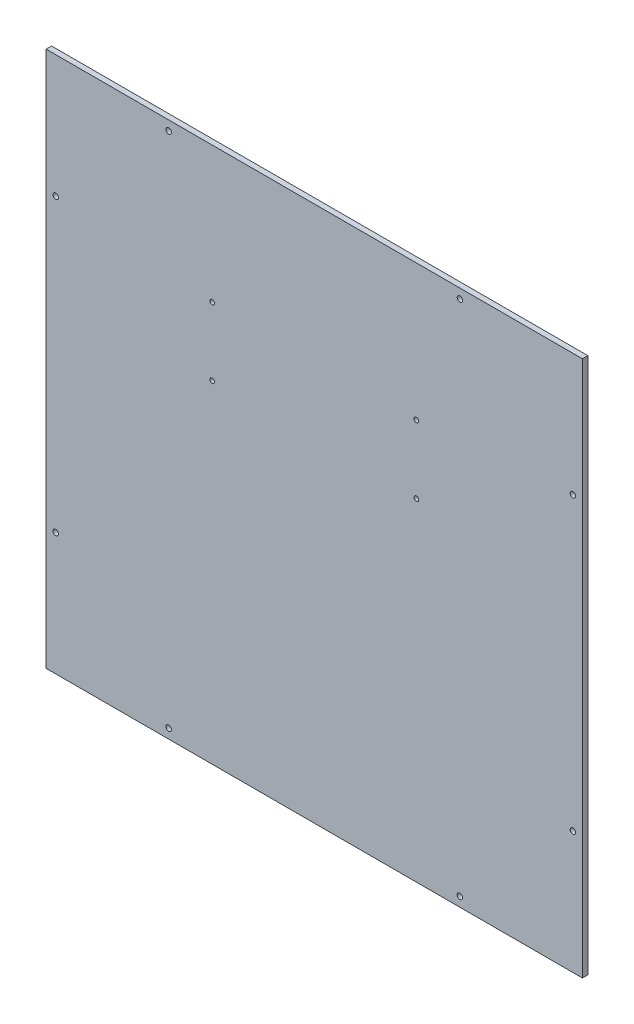
ISO-10303-21;
HEADER;
FILE_DESCRIPTION(('STEP AP214'),'2;1');
FILE_NAME('part.step','',(''),(''),'','','');
FILE_SCHEMA(('AUTOMOTIVE_DESIGN { 1 0 10303 214 1 1 1 1 }'));
ENDSEC;
DATA;
#1=APPLICATION_CONTEXT('core data for automotive mechanical design processes');
#2=APPLICATION_PROTOCOL_DEFINITION('international standard','automotive_design',2000,#1);
#3=PRODUCT_CONTEXT('',#1,'mechanical');
#4=PRODUCT('Part','Part','',(#3));
#5=PRODUCT_RELATED_PRODUCT_CATEGORY('part','',(#4));
#6=PRODUCT_DEFINITION_FORMATION('','',#4);
#7=PRODUCT_DEFINITION_CONTEXT('part definition',#1,'design');
#8=PRODUCT_DEFINITION('design','',#6,#7);
#9=PRODUCT_DEFINITION_SHAPE('','',#8);
#10=(LENGTH_UNIT() NAMED_UNIT(*) SI_UNIT(.MILLI.,.METRE.));
#11=(NAMED_UNIT(*) PLANE_ANGLE_UNIT() SI_UNIT($,.RADIAN.));
#12=(NAMED_UNIT(*) SI_UNIT($,.STERADIAN.) SOLID_ANGLE_UNIT());
#13=UNCERTAINTY_MEASURE_WITH_UNIT(LENGTH_MEASURE(1.E-05),#10,'distance_accuracy_value','');
#14=(GEOMETRIC_REPRESENTATION_CONTEXT(3) GLOBAL_UNCERTAINTY_ASSIGNED_CONTEXT((#13)) GLOBAL_UNIT_ASSIGNED_CONTEXT((#10,
#11,#12)) REPRESENTATION_CONTEXT('',''));
#15=CARTESIAN_POINT('',(0.,0.,0.));
#16=DIRECTION('',(0.,0.,1.));
#17=DIRECTION('',(1.,0.,0.));
#18=AXIS2_PLACEMENT_3D('',#15,#16,#17);
#19=CARTESIAN_POINT('',(0.,0.,4.));
#20=DIRECTION('',(0.,0.,-1.));
#21=DIRECTION('',(-1.,0.,0.));
#22=AXIS2_PLACEMENT_3D('',#19,#20,#21);
#23=PLANE('',#22);
#24=CARTESIAN_POINT('',(272.,244.,4.));
#25=DIRECTION('',(0.,0.,1.));
#26=DIRECTION('',(1.,0.,0.));
#27=AXIS2_PLACEMENT_3D('',#24,#25,#26);
#28=CIRCLE('',#27,1.69999999999996);
#29=CARTESIAN_POINT('',(273.7,244.,4.));
#30=VERTEX_POINT('',#29);
#31=EDGE_CURVE('E180',#30,#30,#28,.T.);
#32=ORIENTED_EDGE('',*,*,#31,.F.);
#33=EDGE_LOOP('',(#32));
#34=FACE_BOUND('',#33,.T.);
#35=CARTESIAN_POINT('',(272.,294.,4.));
#36=DIRECTION('',(0.,0.,1.));
#37=DIRECTION('',(1.,0.,0.));
#38=AXIS2_PLACEMENT_3D('',#35,#36,#37);
#39=CIRCLE('',#38,1.69999999999995);
#40=CARTESIAN_POINT('',(273.7,294.,4.));
#41=VERTEX_POINT('',#40);
#42=EDGE_CURVE('E174',#41,#41,#39,.T.);
#43=ORIENTED_EDGE('',*,*,#42,.F.);
#44=EDGE_LOOP('',(#43));
#45=FACE_BOUND('',#44,.T.);
#46=CARTESIAN_POINT('',(122.,244.,4.));
#47=DIRECTION('',(0.,0.,1.));
#48=DIRECTION('',(1.,0.,0.));
#49=AXIS2_PLACEMENT_3D('',#46,#47,#48);
#50=CIRCLE('',#49,1.70000000000001);
#51=CARTESIAN_POINT('',(123.7,244.,4.));
#52=VERTEX_POINT('',#51);
#53=EDGE_CURVE('E168',#52,#52,#50,.T.);
#54=ORIENTED_EDGE('',*,*,#53,.F.);
#55=EDGE_LOOP('',(#54));
#56=FACE_BOUND('',#55,.T.);
#57=CARTESIAN_POINT('',(122.,294.,4.));
#58=DIRECTION('',(0.,0.,1.));
#59=DIRECTION('',(1.,0.,0.));
#60=AXIS2_PLACEMENT_3D('',#57,#58,#59);
#61=CIRCLE('',#60,1.70000000000001);
#62=CARTESIAN_POINT('',(123.7,294.,4.));
#63=VERTEX_POINT('',#62);
#64=EDGE_CURVE('E162',#63,#63,#61,.T.);
#65=ORIENTED_EDGE('',*,*,#64,.F.);
#66=EDGE_LOOP('',(#65));
#67=FACE_BOUND('',#66,.T.);
#68=CARTESIAN_POINT('',(90.,7.00000000000001,4.));
#69=DIRECTION('',(0.,0.,1.));
#70=DIRECTION('',(-1.,0.,0.));
#71=AXIS2_PLACEMENT_3D('',#68,#69,#70);
#72=CIRCLE('',#71,2.);
#73=CARTESIAN_POINT('',(88.,7.00000000000001,4.));
#74=VERTEX_POINT('',#73);
#75=EDGE_CURVE('E147',#74,#74,#72,.T.);
#76=ORIENTED_EDGE('',*,*,#75,.F.);
#77=EDGE_LOOP('',(#76));
#78=FACE_BOUND('',#77,.T.);
#79=CARTESIAN_POINT('',(387.,90.,4.));
#80=DIRECTION('',(0.,0.,1.));
#81=DIRECTION('',(-1.,0.,0.));
#82=AXIS2_PLACEMENT_3D('',#79,#80,#81);
#83=CIRCLE('',#82,2.);
#84=CARTESIAN_POINT('',(385.,90.,4.));
#85=VERTEX_POINT('',#84);
#86=EDGE_CURVE('E135',#85,#85,#83,.T.);
#87=ORIENTED_EDGE('',*,*,#86,.F.);
#88=EDGE_LOOP('',(#87));
#89=FACE_BOUND('',#88,.T.);
#90=CARTESIAN_POINT('',(387.,304.,4.));
#91=DIRECTION('',(0.,0.,1.));
#92=DIRECTION('',(1.,0.,0.));
#93=AXIS2_PLACEMENT_3D('',#90,#91,#92);
#94=CIRCLE('',#93,2.);
#95=CARTESIAN_POINT('',(389.,304.,4.));
#96=VERTEX_POINT('',#95);
#97=EDGE_CURVE('E123',#96,#96,#94,.T.);
#98=ORIENTED_EDGE('',*,*,#97,.F.);
#99=EDGE_LOOP('',(#98));
#100=FACE_BOUND('',#99,.T.);
#101=CARTESIAN_POINT('',(90.,387.,4.));
#102=DIRECTION('',(0.,0.,1.));
#103=DIRECTION('',(1.,0.,0.));
#104=AXIS2_PLACEMENT_3D('',#101,#102,#103);
#105=CIRCLE('',#104,2.);
#106=CARTESIAN_POINT('',(92.,387.,4.));
#107=VERTEX_POINT('',#106);
#108=EDGE_CURVE('E102',#107,#107,#105,.T.);
#109=ORIENTED_EDGE('',*,*,#108,.F.);
#110=EDGE_LOOP('',(#109));
#111=FACE_BOUND('',#110,.T.);
#112=DIRECTION('',(1.,0.,0.));
#113=VECTOR('',#112,1.);
#114=CARTESIAN_POINT('',(394.,0.,4.));
#115=LINE('',#114,#113);
#116=CARTESIAN_POINT('',(0.,0.,4.));
#117=VERTEX_POINT('',#116);
#118=CARTESIAN_POINT('',(394.,0.,4.));
#119=VERTEX_POINT('',#118);
#120=EDGE_CURVE('E87',#117,#119,#115,.T.);
#121=ORIENTED_EDGE('',*,*,#120,.T.);
#122=DIRECTION('',(0.,1.,0.));
#123=VECTOR('',#122,1.);
#124=CARTESIAN_POINT('',(394.,394.,4.));
#125=LINE('',#124,#123);
#126=CARTESIAN_POINT('',(394.,394.,4.));
#127=VERTEX_POINT('',#126);
#128=EDGE_CURVE('E82',#119,#127,#125,.T.);
#129=ORIENTED_EDGE('',*,*,#128,.T.);
#130=DIRECTION('',(-1.,0.,0.));
#131=VECTOR('',#130,1.);
#132=CARTESIAN_POINT('',(0.,394.,4.));
#133=LINE('',#132,#131);
#134=CARTESIAN_POINT('',(0.,394.,4.));
#135=VERTEX_POINT('',#134);
#136=EDGE_CURVE('E85',#127,#135,#133,.T.);
#137=ORIENTED_EDGE('',*,*,#136,.T.);
#138=DIRECTION('',(0.,-1.,0.));
#139=VECTOR('',#138,1.);
#140=CARTESIAN_POINT('',(0.,0.,4.));
#141=LINE('',#140,#139);
#142=EDGE_CURVE('E52',#135,#117,#141,.T.);
#143=ORIENTED_EDGE('',*,*,#142,.T.);
#144=EDGE_LOOP('',(#121,#129,#137,#143));
#145=FACE_BOUND('',#144,.T.);
#146=CARTESIAN_POINT('',(304.,387.,4.));
#147=DIRECTION('',(0.,0.,1.));
#148=DIRECTION('',(-1.,0.,0.));
#149=AXIS2_PLACEMENT_3D('',#146,#147,#148);
#150=CIRCLE('',#149,2.);
#151=CARTESIAN_POINT('',(302.,387.,4.));
#152=VERTEX_POINT('',#151);
#153=EDGE_CURVE('E117',#152,#152,#150,.T.);
#154=ORIENTED_EDGE('',*,*,#153,.F.);
#155=EDGE_LOOP('',(#154));
#156=FACE_BOUND('',#155,.T.);
#157=CARTESIAN_POINT('',(7.00000000000001,304.,4.));
#158=DIRECTION('',(0.,0.,1.));
#159=DIRECTION('',(-1.,0.,0.));
#160=AXIS2_PLACEMENT_3D('',#157,#158,#159);
#161=CIRCLE('',#160,2.);
#162=CARTESIAN_POINT('',(5.00000000000001,304.,4.));
#163=VERTEX_POINT('',#162);
#164=EDGE_CURVE('E129',#163,#163,#161,.T.);
#165=ORIENTED_EDGE('',*,*,#164,.F.);
#166=EDGE_LOOP('',(#165));
#167=FACE_BOUND('',#166,.T.);
#168=CARTESIAN_POINT('',(304.,7.00000000000001,4.));
#169=DIRECTION('',(0.,0.,1.));
#170=DIRECTION('',(1.,0.,0.));
#171=AXIS2_PLACEMENT_3D('',#168,#169,#170);
#172=CIRCLE('',#171,2.);
#173=CARTESIAN_POINT('',(306.,7.00000000000001,4.));
#174=VERTEX_POINT('',#173);
#175=EDGE_CURVE('E141',#174,#174,#172,.T.);
#176=ORIENTED_EDGE('',*,*,#175,.F.);
#177=EDGE_LOOP('',(#176));
#178=FACE_BOUND('',#177,.T.);
#179=CARTESIAN_POINT('',(7.00000000000001,90.,4.));
#180=DIRECTION('',(0.,0.,1.));
#181=DIRECTION('',(1.,0.,0.));
#182=AXIS2_PLACEMENT_3D('',#179,#180,#181);
#183=CIRCLE('',#182,1.99999999999999);
#184=CARTESIAN_POINT('',(9.,90.,4.));
#185=VERTEX_POINT('',#184);
#186=EDGE_CURVE('E153',#185,#185,#183,.T.);
#187=ORIENTED_EDGE('',*,*,#186,.F.);
#188=EDGE_LOOP('',(#187));
#189=FACE_BOUND('',#188,.T.);
#190=ADVANCED_FACE('F35',(#34,#45,#56,#67,#78,#89,#100,#111,#145,#156,#167,#178,#189),#23,.F.);
#191=CARTESIAN_POINT('',(0.,0.,0.));
#192=DIRECTION('',(0.,0.,-1.));
#193=DIRECTION('',(-1.,0.,0.));
#194=AXIS2_PLACEMENT_3D('',#191,#192,#193);
#195=PLANE('',#194);
#196=CARTESIAN_POINT('',(272.,244.,0.));
#197=DIRECTION('',(0.,0.,1.));
#198=DIRECTION('',(1.,0.,0.));
#199=AXIS2_PLACEMENT_3D('',#196,#197,#198);
#200=CIRCLE('',#199,1.69999999999996);
#201=CARTESIAN_POINT('',(273.7,244.,0.));
#202=VERTEX_POINT('',#201);
#203=EDGE_CURVE('E177',#202,#202,#200,.T.);
#204=ORIENTED_EDGE('',*,*,#203,.T.);
#205=EDGE_LOOP('',(#204));
#206=FACE_BOUND('',#205,.T.);
#207=CARTESIAN_POINT('',(272.,294.,0.));
#208=DIRECTION('',(0.,0.,1.));
#209=DIRECTION('',(1.,0.,0.));
#210=AXIS2_PLACEMENT_3D('',#207,#208,#209);
#211=CIRCLE('',#210,1.69999999999995);
#212=CARTESIAN_POINT('',(273.7,294.,0.));
#213=VERTEX_POINT('',#212);
#214=EDGE_CURVE('E171',#213,#213,#211,.T.);
#215=ORIENTED_EDGE('',*,*,#214,.T.);
#216=EDGE_LOOP('',(#215));
#217=FACE_BOUND('',#216,.T.);
#218=CARTESIAN_POINT('',(122.,244.,0.));
#219=DIRECTION('',(0.,0.,1.));
#220=DIRECTION('',(1.,0.,0.));
#221=AXIS2_PLACEMENT_3D('',#218,#219,#220);
#222=CIRCLE('',#221,1.70000000000001);
#223=CARTESIAN_POINT('',(123.7,244.,0.));
#224=VERTEX_POINT('',#223);
#225=EDGE_CURVE('E165',#224,#224,#222,.T.);
#226=ORIENTED_EDGE('',*,*,#225,.T.);
#227=EDGE_LOOP('',(#226));
#228=FACE_BOUND('',#227,.T.);
#229=CARTESIAN_POINT('',(122.,294.,0.));
#230=DIRECTION('',(0.,0.,1.));
#231=DIRECTION('',(1.,0.,0.));
#232=AXIS2_PLACEMENT_3D('',#229,#230,#231);
#233=CIRCLE('',#232,1.70000000000001);
#234=CARTESIAN_POINT('',(123.7,294.,0.));
#235=VERTEX_POINT('',#234);
#236=EDGE_CURVE('E159',#235,#235,#233,.T.);
#237=ORIENTED_EDGE('',*,*,#236,.T.);
#238=EDGE_LOOP('',(#237));
#239=FACE_BOUND('',#238,.T.);
#240=CARTESIAN_POINT('',(90.,7.00000000000001,0.));
#241=DIRECTION('',(0.,0.,1.));
#242=DIRECTION('',(-1.,0.,0.));
#243=AXIS2_PLACEMENT_3D('',#240,#241,#242);
#244=CIRCLE('',#243,2.);
#245=CARTESIAN_POINT('',(88.,7.00000000000001,0.));
#246=VERTEX_POINT('',#245);
#247=EDGE_CURVE('E150',#246,#246,#244,.T.);
#248=ORIENTED_EDGE('',*,*,#247,.T.);
#249=EDGE_LOOP('',(#248));
#250=FACE_BOUND('',#249,.T.);
#251=CARTESIAN_POINT('',(387.,90.,0.));
#252=DIRECTION('',(0.,0.,1.));
#253=DIRECTION('',(-1.,0.,0.));
#254=AXIS2_PLACEMENT_3D('',#251,#252,#253);
#255=CIRCLE('',#254,2.);
#256=CARTESIAN_POINT('',(385.,90.,0.));
#257=VERTEX_POINT('',#256);
#258=EDGE_CURVE('E138',#257,#257,#255,.T.);
#259=ORIENTED_EDGE('',*,*,#258,.T.);
#260=EDGE_LOOP('',(#259));
#261=FACE_BOUND('',#260,.T.);
#262=CARTESIAN_POINT('',(387.,304.,0.));
#263=DIRECTION('',(0.,0.,1.));
#264=DIRECTION('',(1.,0.,0.));
#265=AXIS2_PLACEMENT_3D('',#262,#263,#264);
#266=CIRCLE('',#265,2.);
#267=CARTESIAN_POINT('',(389.,304.,0.));
#268=VERTEX_POINT('',#267);
#269=EDGE_CURVE('E126',#268,#268,#266,.T.);
#270=ORIENTED_EDGE('',*,*,#269,.T.);
#271=EDGE_LOOP('',(#270));
#272=FACE_BOUND('',#271,.T.);
#273=CARTESIAN_POINT('',(90.,387.,0.));
#274=DIRECTION('',(0.,0.,1.));
#275=DIRECTION('',(1.,0.,0.));
#276=AXIS2_PLACEMENT_3D('',#273,#274,#275);
#277=CIRCLE('',#276,2.);
#278=CARTESIAN_POINT('',(92.,387.,0.));
#279=VERTEX_POINT('',#278);
#280=EDGE_CURVE('E114',#279,#279,#277,.T.);
#281=ORIENTED_EDGE('',*,*,#280,.T.);
#282=EDGE_LOOP('',(#281));
#283=FACE_BOUND('',#282,.T.);
#284=DIRECTION('',(1.,0.,0.));
#285=VECTOR('',#284,1.);
#286=CARTESIAN_POINT('',(394.,0.,0.));
#287=LINE('',#286,#285);
#288=CARTESIAN_POINT('',(0.,0.,0.));
#289=VERTEX_POINT('',#288);
#290=CARTESIAN_POINT('',(394.,0.,0.));
#291=VERTEX_POINT('',#290);
#292=EDGE_CURVE('E99',#289,#291,#287,.T.);
#293=ORIENTED_EDGE('',*,*,#292,.F.);
#294=DIRECTION('',(0.,-1.,0.));
#295=VECTOR('',#294,1.);
#296=CARTESIAN_POINT('',(0.,0.,0.));
#297=LINE('',#296,#295);
#298=CARTESIAN_POINT('',(0.,394.,0.));
#299=VERTEX_POINT('',#298);
#300=EDGE_CURVE('E75',#299,#289,#297,.T.);
#301=ORIENTED_EDGE('',*,*,#300,.F.);
#302=DIRECTION('',(-1.,0.,0.));
#303=VECTOR('',#302,1.);
#304=CARTESIAN_POINT('',(0.,394.,0.));
#305=LINE('',#304,#303);
#306=CARTESIAN_POINT('',(394.,394.,0.));
#307=VERTEX_POINT('',#306);
#308=EDGE_CURVE('E69',#307,#299,#305,.T.);
#309=ORIENTED_EDGE('',*,*,#308,.F.);
#310=DIRECTION('',(0.,1.,0.));
#311=VECTOR('',#310,1.);
#312=CARTESIAN_POINT('',(394.,394.,0.));
#313=LINE('',#312,#311);
#314=EDGE_CURVE('E91',#291,#307,#313,.T.);
#315=ORIENTED_EDGE('',*,*,#314,.F.);
#316=EDGE_LOOP('',(#293,#301,#309,#315));
#317=FACE_BOUND('',#316,.T.);
#318=CARTESIAN_POINT('',(304.,387.,0.));
#319=DIRECTION('',(0.,0.,1.));
#320=DIRECTION('',(-1.,0.,0.));
#321=AXIS2_PLACEMENT_3D('',#318,#319,#320);
#322=CIRCLE('',#321,2.);
#323=CARTESIAN_POINT('',(302.,387.,0.));
#324=VERTEX_POINT('',#323);
#325=EDGE_CURVE('E120',#324,#324,#322,.T.);
#326=ORIENTED_EDGE('',*,*,#325,.T.);
#327=EDGE_LOOP('',(#326));
#328=FACE_BOUND('',#327,.T.);
#329=CARTESIAN_POINT('',(7.00000000000001,304.,0.));
#330=DIRECTION('',(0.,0.,1.));
#331=DIRECTION('',(-1.,0.,0.));
#332=AXIS2_PLACEMENT_3D('',#329,#330,#331);
#333=CIRCLE('',#332,2.);
#334=CARTESIAN_POINT('',(5.00000000000001,304.,0.));
#335=VERTEX_POINT('',#334);
#336=EDGE_CURVE('E132',#335,#335,#333,.T.);
#337=ORIENTED_EDGE('',*,*,#336,.T.);
#338=EDGE_LOOP('',(#337));
#339=FACE_BOUND('',#338,.T.);
#340=CARTESIAN_POINT('',(304.,7.00000000000001,0.));
#341=DIRECTION('',(0.,0.,1.));
#342=DIRECTION('',(1.,0.,0.));
#343=AXIS2_PLACEMENT_3D('',#340,#341,#342);
#344=CIRCLE('',#343,2.);
#345=CARTESIAN_POINT('',(306.,7.00000000000001,0.));
#346=VERTEX_POINT('',#345);
#347=EDGE_CURVE('E144',#346,#346,#344,.T.);
#348=ORIENTED_EDGE('',*,*,#347,.T.);
#349=EDGE_LOOP('',(#348));
#350=FACE_BOUND('',#349,.T.);
#351=CARTESIAN_POINT('',(7.00000000000001,90.,0.));
#352=DIRECTION('',(0.,0.,1.));
#353=DIRECTION('',(1.,0.,0.));
#354=AXIS2_PLACEMENT_3D('',#351,#352,#353);
#355=CIRCLE('',#354,1.99999999999999);
#356=CARTESIAN_POINT('',(9.,90.,0.));
#357=VERTEX_POINT('',#356);
#358=EDGE_CURVE('E156',#357,#357,#355,.T.);
#359=ORIENTED_EDGE('',*,*,#358,.T.);
#360=EDGE_LOOP('',(#359));
#361=FACE_BOUND('',#360,.T.);
#362=ADVANCED_FACE('F110',(#206,#217,#228,#239,#250,#261,#272,#283,#317,#328,#339,#350,#361),
#195,.T.);
#363=CARTESIAN_POINT('',(394.,0.,4.));
#364=DIRECTION('',(0.,1.,0.));
#365=DIRECTION('',(-1.,0.,0.));
#366=AXIS2_PLACEMENT_3D('',#363,#364,#365);
#367=PLANE('',#366);
#368=ORIENTED_EDGE('',*,*,#292,.T.);
#369=DIRECTION('',(0.,0.,-1.));
#370=VECTOR('',#369,1.);
#371=CARTESIAN_POINT('',(394.,0.,4.));
#372=LINE('',#371,#370);
#373=EDGE_CURVE('E11',#119,#291,#372,.T.);
#374=ORIENTED_EDGE('',*,*,#373,.F.);
#375=ORIENTED_EDGE('',*,*,#120,.F.);
#376=DIRECTION('',(0.,0.,-1.));
#377=VECTOR('',#376,1.);
#378=CARTESIAN_POINT('',(0.,0.,4.));
#379=LINE('',#378,#377);
#380=EDGE_CURVE('E95',#117,#289,#379,.T.);
#381=ORIENTED_EDGE('',*,*,#380,.T.);
#382=EDGE_LOOP('',(#368,#374,#375,#381));
#383=FACE_BOUND('',#382,.T.);
#384=ADVANCED_FACE('F37',(#383),#367,.F.);
#385=CARTESIAN_POINT('',(394.,394.,4.));
#386=DIRECTION('',(-1.,0.,0.));
#387=DIRECTION('',(0.,0.,1.));
#388=AXIS2_PLACEMENT_3D('',#385,#386,#387);
#389=PLANE('',#388);
#390=ORIENTED_EDGE('',*,*,#314,.T.);
#391=DIRECTION('',(0.,0.,-1.));
#392=VECTOR('',#391,1.);
#393=CARTESIAN_POINT('',(394.,394.,4.));
#394=LINE('',#393,#392);
#395=EDGE_CURVE('E44',#127,#307,#394,.T.);
#396=ORIENTED_EDGE('',*,*,#395,.F.);
#397=ORIENTED_EDGE('',*,*,#128,.F.);
#398=ORIENTED_EDGE('',*,*,#373,.T.);
#399=EDGE_LOOP('',(#390,#396,#397,#398));
#400=FACE_BOUND('',#399,.T.);
#401=ADVANCED_FACE('F90',(#400),#389,.F.);
#402=CARTESIAN_POINT('',(0.,394.,4.));
#403=DIRECTION('',(0.,-1.,0.));
#404=DIRECTION('',(0.,0.,-1.));
#405=AXIS2_PLACEMENT_3D('',#402,#403,#404);
#406=PLANE('',#405);
#407=ORIENTED_EDGE('',*,*,#308,.T.);
#408=DIRECTION('',(0.,0.,-1.));
#409=VECTOR('',#408,1.);
#410=CARTESIAN_POINT('',(0.,394.,4.));
#411=LINE('',#410,#409);
#412=EDGE_CURVE('E92',#135,#299,#411,.T.);
#413=ORIENTED_EDGE('',*,*,#412,.F.);
#414=ORIENTED_EDGE('',*,*,#136,.F.);
#415=ORIENTED_EDGE('',*,*,#395,.T.);
#416=EDGE_LOOP('',(#407,#413,#414,#415));
#417=FACE_BOUND('',#416,.T.);
#418=ADVANCED_FACE('F93',(#417),#406,.F.);
#419=CARTESIAN_POINT('',(0.,0.,4.));
#420=DIRECTION('',(1.,0.,0.));
#421=DIRECTION('',(0.,0.,-1.));
#422=AXIS2_PLACEMENT_3D('',#419,#420,#421);
#423=PLANE('',#422);
#424=ORIENTED_EDGE('',*,*,#300,.T.);
#425=ORIENTED_EDGE('',*,*,#380,.F.);
#426=ORIENTED_EDGE('',*,*,#142,.F.);
#427=ORIENTED_EDGE('',*,*,#412,.T.);
#428=EDGE_LOOP('',(#424,#425,#426,#427));
#429=FACE_BOUND('',#428,.T.);
#430=ADVANCED_FACE('F107',(#429),#423,.F.);
#431=CARTESIAN_POINT('',(90.,387.,4.));
#432=DIRECTION('',(0.,0.,-1.));
#433=DIRECTION('',(-1.,0.,0.));
#434=AXIS2_PLACEMENT_3D('',#431,#432,#433);
#435=CYLINDRICAL_SURFACE('',#434,2.);
#436=ORIENTED_EDGE('',*,*,#108,.T.);
#437=EDGE_LOOP('',(#436));
#438=FACE_BOUND('',#437,.T.);
#439=ORIENTED_EDGE('',*,*,#280,.F.);
#440=EDGE_LOOP('',(#439));
#441=FACE_BOUND('',#440,.T.);
#442=ADVANCED_FACE('F212',(#438,#441),#435,.F.);
#443=CARTESIAN_POINT('',(304.,387.,4.));
#444=DIRECTION('',(0.,0.,-1.));
#445=DIRECTION('',(-1.,0.,0.));
#446=AXIS2_PLACEMENT_3D('',#443,#444,#445);
#447=CYLINDRICAL_SURFACE('',#446,2.);
#448=ORIENTED_EDGE('',*,*,#153,.T.);
#449=EDGE_LOOP('',(#448));
#450=FACE_BOUND('',#449,.T.);
#451=ORIENTED_EDGE('',*,*,#325,.F.);
#452=EDGE_LOOP('',(#451));
#453=FACE_BOUND('',#452,.T.);
#454=ADVANCED_FACE('F215',(#450,#453),#447,.F.);
#455=CARTESIAN_POINT('',(387.,304.,4.));
#456=DIRECTION('',(0.,0.,-1.));
#457=DIRECTION('',(-1.,0.,0.));
#458=AXIS2_PLACEMENT_3D('',#455,#456,#457);
#459=CYLINDRICAL_SURFACE('',#458,2.);
#460=ORIENTED_EDGE('',*,*,#97,.T.);
#461=EDGE_LOOP('',(#460));
#462=FACE_BOUND('',#461,.T.);
#463=ORIENTED_EDGE('',*,*,#269,.F.);
#464=EDGE_LOOP('',(#463));
#465=FACE_BOUND('',#464,.T.);
#466=ADVANCED_FACE('F251',(#462,#465),#459,.F.);
#467=CARTESIAN_POINT('',(7.00000000000001,304.,4.));
#468=DIRECTION('',(0.,0.,-1.));
#469=DIRECTION('',(-1.,0.,0.));
#470=AXIS2_PLACEMENT_3D('',#467,#468,#469);
#471=CYLINDRICAL_SURFACE('',#470,2.);
#472=ORIENTED_EDGE('',*,*,#164,.T.);
#473=EDGE_LOOP('',(#472));
#474=FACE_BOUND('',#473,.T.);
#475=ORIENTED_EDGE('',*,*,#336,.F.);
#476=EDGE_LOOP('',(#475));
#477=FACE_BOUND('',#476,.T.);
#478=ADVANCED_FACE('F259',(#474,#477),#471,.F.);
#479=CARTESIAN_POINT('',(387.,90.,4.));
#480=DIRECTION('',(0.,0.,-1.));
#481=DIRECTION('',(-1.,0.,0.));
#482=AXIS2_PLACEMENT_3D('',#479,#480,#481);
#483=CYLINDRICAL_SURFACE('',#482,2.);
#484=ORIENTED_EDGE('',*,*,#86,.T.);
#485=EDGE_LOOP('',(#484));
#486=FACE_BOUND('',#485,.T.);
#487=ORIENTED_EDGE('',*,*,#258,.F.);
#488=EDGE_LOOP('',(#487));
#489=FACE_BOUND('',#488,.T.);
#490=ADVANCED_FACE('F267',(#486,#489),#483,.F.);
#491=CARTESIAN_POINT('',(304.,7.00000000000001,4.));
#492=DIRECTION('',(0.,0.,-1.));
#493=DIRECTION('',(-1.,0.,0.));
#494=AXIS2_PLACEMENT_3D('',#491,#492,#493);
#495=CYLINDRICAL_SURFACE('',#494,2.);
#496=ORIENTED_EDGE('',*,*,#175,.T.);
#497=EDGE_LOOP('',(#496));
#498=FACE_BOUND('',#497,.T.);
#499=ORIENTED_EDGE('',*,*,#347,.F.);
#500=EDGE_LOOP('',(#499));
#501=FACE_BOUND('',#500,.T.);
#502=ADVANCED_FACE('F275',(#498,#501),#495,.F.);
#503=CARTESIAN_POINT('',(90.,7.00000000000001,4.));
#504=DIRECTION('',(0.,0.,-1.));
#505=DIRECTION('',(-1.,0.,0.));
#506=AXIS2_PLACEMENT_3D('',#503,#504,#505);
#507=CYLINDRICAL_SURFACE('',#506,2.);
#508=ORIENTED_EDGE('',*,*,#75,.T.);
#509=EDGE_LOOP('',(#508));
#510=FACE_BOUND('',#509,.T.);
#511=ORIENTED_EDGE('',*,*,#247,.F.);
#512=EDGE_LOOP('',(#511));
#513=FACE_BOUND('',#512,.T.);
#514=ADVANCED_FACE('F283',(#510,#513),#507,.F.);
#515=CARTESIAN_POINT('',(7.00000000000001,90.,4.));
#516=DIRECTION('',(0.,0.,-1.));
#517=DIRECTION('',(-1.,0.,0.));
#518=AXIS2_PLACEMENT_3D('',#515,#516,#517);
#519=CYLINDRICAL_SURFACE('',#518,1.99999999999999);
#520=ORIENTED_EDGE('',*,*,#186,.T.);
#521=EDGE_LOOP('',(#520));
#522=FACE_BOUND('',#521,.T.);
#523=ORIENTED_EDGE('',*,*,#358,.F.);
#524=EDGE_LOOP('',(#523));
#525=FACE_BOUND('',#524,.T.);
#526=ADVANCED_FACE('F291',(#522,#525),#519,.F.);
#527=CARTESIAN_POINT('',(122.,294.,0.));
#528=DIRECTION('',(0.,0.,1.));
#529=DIRECTION('',(1.,0.,0.));
#530=AXIS2_PLACEMENT_3D('',#527,#528,#529);
#531=CYLINDRICAL_SURFACE('',#530,1.70000000000001);
#532=ORIENTED_EDGE('',*,*,#236,.F.);
#533=EDGE_LOOP('',(#532));
#534=FACE_BOUND('',#533,.T.);
#535=ORIENTED_EDGE('',*,*,#64,.T.);
#536=EDGE_LOOP('',(#535));
#537=FACE_BOUND('',#536,.T.);
#538=ADVANCED_FACE('F299',(#534,#537),#531,.F.);
#539=CARTESIAN_POINT('',(122.,244.,0.));
#540=DIRECTION('',(0.,0.,1.));
#541=DIRECTION('',(1.,0.,0.));
#542=AXIS2_PLACEMENT_3D('',#539,#540,#541);
#543=CYLINDRICAL_SURFACE('',#542,1.70000000000001);
#544=ORIENTED_EDGE('',*,*,#225,.F.);
#545=EDGE_LOOP('',(#544));
#546=FACE_BOUND('',#545,.T.);
#547=ORIENTED_EDGE('',*,*,#53,.T.);
#548=EDGE_LOOP('',(#547));
#549=FACE_BOUND('',#548,.T.);
#550=ADVANCED_FACE('F308',(#546,#549),#543,.F.);
#551=CARTESIAN_POINT('',(272.,294.,0.));
#552=DIRECTION('',(0.,0.,1.));
#553=DIRECTION('',(1.,0.,0.));
#554=AXIS2_PLACEMENT_3D('',#551,#552,#553);
#555=CYLINDRICAL_SURFACE('',#554,1.69999999999995);
#556=ORIENTED_EDGE('',*,*,#214,.F.);
#557=EDGE_LOOP('',(#556));
#558=FACE_BOUND('',#557,.T.);
#559=ORIENTED_EDGE('',*,*,#42,.T.);
#560=EDGE_LOOP('',(#559));
#561=FACE_BOUND('',#560,.T.);
#562=ADVANCED_FACE('F191',(#558,#561),#555,.F.);
#563=CARTESIAN_POINT('',(272.,244.,0.));
#564=DIRECTION('',(0.,0.,1.));
#565=DIRECTION('',(1.,0.,0.));
#566=AXIS2_PLACEMENT_3D('',#563,#564,#565);
#567=CYLINDRICAL_SURFACE('',#566,1.69999999999996);
#568=ORIENTED_EDGE('',*,*,#203,.F.);
#569=EDGE_LOOP('',(#568));
#570=FACE_BOUND('',#569,.T.);
#571=ORIENTED_EDGE('',*,*,#31,.T.);
#572=EDGE_LOOP('',(#571));
#573=FACE_BOUND('',#572,.T.);
#574=ADVANCED_FACE('F188',(#570,#573),#567,.F.);
#575=CLOSED_SHELL('',(#190,#362,#384,#401,#418,#430,#442,#454,#466,#478,#490,#502,#514,#526,
#538,#550,#562,#574));
#576=MANIFOLD_SOLID_BREP('B2',#575);
#577=ADVANCED_BREP_SHAPE_REPRESENTATION('',(#18,#576),#14);
#578=SHAPE_DEFINITION_REPRESENTATION(#9,#577);
ENDSEC;
END-ISO-10303-21;
